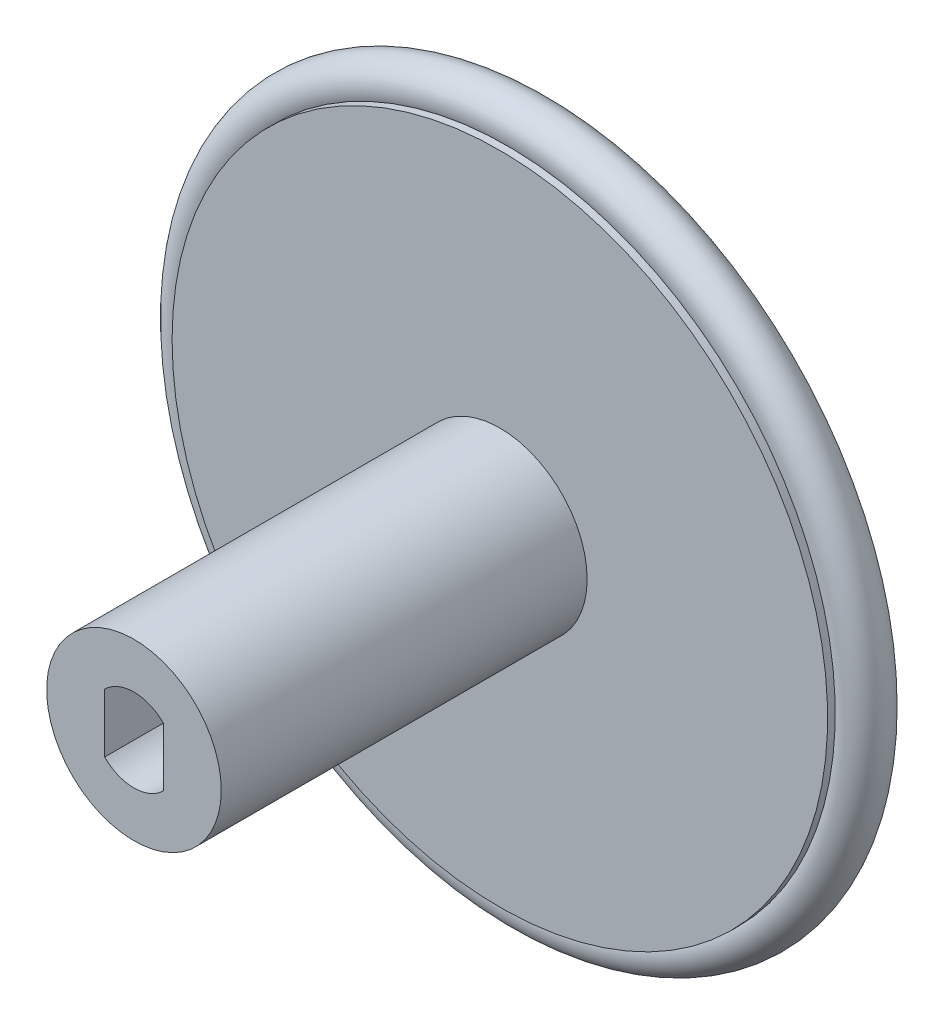
ISO-10303-21;
HEADER;
FILE_DESCRIPTION(('STEP AP214'),'2;1');
FILE_NAME('part.step','',(''),(''),'','','');
FILE_SCHEMA(('AUTOMOTIVE_DESIGN { 1 0 10303 214 1 1 1 1 }'));
ENDSEC;
DATA;
#1=APPLICATION_CONTEXT('core data for automotive mechanical design processes');
#2=APPLICATION_PROTOCOL_DEFINITION('international standard','automotive_design',2000,#1);
#3=PRODUCT_CONTEXT('',#1,'mechanical');
#4=PRODUCT('Part','Part','',(#3));
#5=PRODUCT_RELATED_PRODUCT_CATEGORY('part','',(#4));
#6=PRODUCT_DEFINITION_FORMATION('','',#4);
#7=PRODUCT_DEFINITION_CONTEXT('part definition',#1,'design');
#8=PRODUCT_DEFINITION('design','',#6,#7);
#9=PRODUCT_DEFINITION_SHAPE('','',#8);
#10=(LENGTH_UNIT() NAMED_UNIT(*) SI_UNIT(.MILLI.,.METRE.));
#11=(NAMED_UNIT(*) PLANE_ANGLE_UNIT() SI_UNIT($,.RADIAN.));
#12=(NAMED_UNIT(*) SI_UNIT($,.STERADIAN.) SOLID_ANGLE_UNIT());
#13=UNCERTAINTY_MEASURE_WITH_UNIT(LENGTH_MEASURE(1.E-05),#10,'distance_accuracy_value','');
#14=(GEOMETRIC_REPRESENTATION_CONTEXT(3) GLOBAL_UNCERTAINTY_ASSIGNED_CONTEXT((#13)) GLOBAL_UNIT_ASSIGNED_CONTEXT((#10,
#11,#12)) REPRESENTATION_CONTEXT('',''));
#15=CARTESIAN_POINT('',(0.,0.,0.));
#16=DIRECTION('',(0.,0.,1.));
#17=DIRECTION('',(1.,0.,0.));
#18=AXIS2_PLACEMENT_3D('',#15,#16,#17);
#19=CARTESIAN_POINT('',(0.,0.,0.));
#20=DIRECTION('',(0.,0.,1.));
#21=DIRECTION('',(1.,0.,0.));
#22=AXIS2_PLACEMENT_3D('',#19,#20,#21);
#23=TOROIDAL_SURFACE('',#22,22.039552593733,1.5);
#24=CARTESIAN_POINT('',(23.539552593733,0.,0.));
#25=VERTEX_POINT('',#24);
#26=VERTEX_LOOP('',#25);
#27=FACE_BOUND('',#26,.T.);
#28=ADVANCED_FACE('F44',(#27),#23,.T.);
#29=CLOSED_SHELL('',(#28));
#30=MANIFOLD_SOLID_BREP('B2_NOT_SHOWN',#29);
#31=CARTESIAN_POINT('',(0.,0.,-1.90000000000001));
#32=DIRECTION('',(0.,0.,-1.));
#33=DIRECTION('',(-1.,0.,0.));
#34=AXIS2_PLACEMENT_3D('',#31,#32,#33);
#35=PLANE('',#34);
#36=CARTESIAN_POINT('',(0.,0.,-1.90000000000001));
#37=DIRECTION('',(0.,0.,-1.));
#38=DIRECTION('',(-1.,0.,0.));
#39=AXIS2_PLACEMENT_3D('',#36,#37,#38);
#40=CIRCLE('',#39,21.5);
#41=CARTESIAN_POINT('',(-21.5,0.,-1.90000000000001));
#42=VERTEX_POINT('',#41);
#43=EDGE_CURVE('E59',#42,#42,#40,.T.);
#44=ORIENTED_EDGE('',*,*,#43,.T.);
#45=EDGE_LOOP('',(#44));
#46=FACE_BOUND('',#45,.T.);
#47=ADVANCED_FACE('F56',(#46),#35,.T.);
#48=CARTESIAN_POINT('',(0.,0.,-6.22705657946134));
#49=DIRECTION('',(0.,0.,-1.));
#50=DIRECTION('',(-1.,0.,0.));
#51=AXIS2_PLACEMENT_3D('',#48,#49,#50);
#52=CYLINDRICAL_SURFACE('',#51,21.5);
#53=CARTESIAN_POINT('',(0.,0.,-1.40000000000001));
#54=DIRECTION('',(0.,0.,-1.));
#55=DIRECTION('',(-1.,0.,0.));
#56=AXIS2_PLACEMENT_3D('',#53,#54,#55);
#57=CIRCLE('',#56,21.5);
#58=CARTESIAN_POINT('',(-21.5,0.,-1.40000000000001));
#59=VERTEX_POINT('',#58);
#60=EDGE_CURVE('E147',#59,#59,#57,.T.);
#61=ORIENTED_EDGE('',*,*,#60,.T.);
#62=EDGE_LOOP('',(#61));
#63=FACE_BOUND('',#62,.T.);
#64=ORIENTED_EDGE('',*,*,#43,.F.);
#65=EDGE_LOOP('',(#64));
#66=FACE_BOUND('',#65,.T.);
#67=ADVANCED_FACE('F155',(#63,#66),#52,.T.);
#68=CARTESIAN_POINT('',(0.,0.,-1.40000000000001));
#69=DIRECTION('',(0.,0.,-1.));
#70=DIRECTION('',(-1.,0.,0.));
#71=AXIS2_PLACEMENT_3D('',#68,#69,#70);
#72=CONICAL_SURFACE('',#71,21.5,1.22522113490003);
#73=CARTESIAN_POINT('',(0.,0.,-0.500000000000015));
#74=DIRECTION('',(0.,0.,-1.));
#75=DIRECTION('',(-1.,0.,0.));
#76=AXIS2_PLACEMENT_3D('',#73,#74,#75);
#77=CIRCLE('',#76,19.0001538314765);
#78=CARTESIAN_POINT('',(-19.0001538314765,0.,-0.500000000000015));
#79=VERTEX_POINT('',#78);
#80=EDGE_CURVE('E145',#79,#79,#77,.T.);
#81=ORIENTED_EDGE('',*,*,#80,.T.);
#82=EDGE_LOOP('',(#81));
#83=FACE_BOUND('',#82,.T.);
#84=ORIENTED_EDGE('',*,*,#60,.F.);
#85=EDGE_LOOP('',(#84));
#86=FACE_BOUND('',#85,.T.);
#87=ADVANCED_FACE('F157',(#83,#86),#72,.T.);
#88=CARTESIAN_POINT('',(0.,0.,-6.22705657946134));
#89=DIRECTION('',(0.,0.,-1.));
#90=DIRECTION('',(-1.,0.,0.));
#91=AXIS2_PLACEMENT_3D('',#88,#89,#90);
#92=CYLINDRICAL_SURFACE('',#91,19.0001538314765);
#93=CARTESIAN_POINT('',(0.,0.,0.500000000000007));
#94=DIRECTION('',(0.,0.,-1.));
#95=DIRECTION('',(-1.,0.,0.));
#96=AXIS2_PLACEMENT_3D('',#93,#94,#95);
#97=CIRCLE('',#96,19.0001538314765);
#98=CARTESIAN_POINT('',(-19.0001538314765,0.,0.500000000000007));
#99=VERTEX_POINT('',#98);
#100=EDGE_CURVE('E142',#99,#99,#97,.T.);
#101=ORIENTED_EDGE('',*,*,#100,.T.);
#102=EDGE_LOOP('',(#101));
#103=FACE_BOUND('',#102,.T.);
#104=ORIENTED_EDGE('',*,*,#80,.F.);
#105=EDGE_LOOP('',(#104));
#106=FACE_BOUND('',#105,.T.);
#107=ADVANCED_FACE('F162',(#103,#106),#92,.T.);
#108=CARTESIAN_POINT('',(0.,0.,0.500000000000007));
#109=DIRECTION('',(0.,0.,1.));
#110=DIRECTION('',(1.,0.,0.));
#111=AXIS2_PLACEMENT_3D('',#108,#109,#110);
#112=CONICAL_SURFACE('',#111,19.0001538314765,1.22522113490003);
#113=CARTESIAN_POINT('',(0.,0.,1.4));
#114=DIRECTION('',(0.,0.,-1.));
#115=DIRECTION('',(-1.,0.,0.));
#116=AXIS2_PLACEMENT_3D('',#113,#114,#115);
#117=CIRCLE('',#116,21.5);
#118=CARTESIAN_POINT('',(-21.5,0.,1.4));
#119=VERTEX_POINT('',#118);
#120=EDGE_CURVE('E139',#119,#119,#117,.T.);
#121=ORIENTED_EDGE('',*,*,#120,.T.);
#122=EDGE_LOOP('',(#121));
#123=FACE_BOUND('',#122,.T.);
#124=ORIENTED_EDGE('',*,*,#100,.F.);
#125=EDGE_LOOP('',(#124));
#126=FACE_BOUND('',#125,.T.);
#127=ADVANCED_FACE('F168',(#123,#126),#112,.T.);
#128=CARTESIAN_POINT('',(0.,0.,-6.22705657946134));
#129=DIRECTION('',(0.,0.,-1.));
#130=DIRECTION('',(-1.,0.,0.));
#131=AXIS2_PLACEMENT_3D('',#128,#129,#130);
#132=CYLINDRICAL_SURFACE('',#131,21.5);
#133=CARTESIAN_POINT('',(0.,0.,1.9));
#134=DIRECTION('',(0.,0.,-1.));
#135=DIRECTION('',(-1.,0.,0.));
#136=AXIS2_PLACEMENT_3D('',#133,#134,#135);
#137=CIRCLE('',#136,21.5);
#138=CARTESIAN_POINT('',(-21.5,0.,1.9));
#139=VERTEX_POINT('',#138);
#140=EDGE_CURVE('E135',#139,#139,#137,.T.);
#141=ORIENTED_EDGE('',*,*,#140,.T.);
#142=EDGE_LOOP('',(#141));
#143=FACE_BOUND('',#142,.T.);
#144=ORIENTED_EDGE('',*,*,#120,.F.);
#145=EDGE_LOOP('',(#144));
#146=FACE_BOUND('',#145,.T.);
#147=ADVANCED_FACE('F172',(#143,#146),#132,.T.);
#148=CARTESIAN_POINT('',(0.,0.,1.9));
#149=DIRECTION('',(0.,0.,1.));
#150=DIRECTION('',(1.,0.,0.));
#151=AXIS2_PLACEMENT_3D('',#148,#149,#150);
#152=PLANE('',#151);
#153=CARTESIAN_POINT('',(0.,0.,1.9));
#154=DIRECTION('',(0.,0.,1.));
#155=DIRECTION('',(1.,0.,0.));
#156=AXIS2_PLACEMENT_3D('',#153,#154,#155);
#157=CIRCLE('',#156,5.725);
#158=CARTESIAN_POINT('',(5.725,0.,1.9));
#159=VERTEX_POINT('',#158);
#160=EDGE_CURVE('E42',#159,#159,#157,.T.);
#161=ORIENTED_EDGE('',*,*,#160,.F.);
#162=EDGE_LOOP('',(#161));
#163=FACE_BOUND('',#162,.T.);
#164=ORIENTED_EDGE('',*,*,#140,.F.);
#165=EDGE_LOOP('',(#164));
#166=FACE_BOUND('',#165,.T.);
#167=ADVANCED_FACE('F176',(#163,#166),#152,.T.);
#168=CARTESIAN_POINT('',(0.,0.,25.9));
#169=DIRECTION('',(0.,0.,1.));
#170=DIRECTION('',(1.,0.,0.));
#171=AXIS2_PLACEMENT_3D('',#168,#169,#170);
#172=PLANE('',#171);
#173=CARTESIAN_POINT('',(0.,0.,25.9));
#174=DIRECTION('',(0.,0.,1.));
#175=DIRECTION('',(1.,0.,0.));
#176=AXIS2_PLACEMENT_3D('',#173,#174,#175);
#177=CIRCLE('',#176,5.725);
#178=CARTESIAN_POINT('',(5.725,0.,25.9));
#179=VERTEX_POINT('',#178);
#180=EDGE_CURVE('E133',#179,#179,#177,.T.);
#181=ORIENTED_EDGE('',*,*,#180,.T.);
#182=EDGE_LOOP('',(#181));
#183=FACE_BOUND('',#182,.T.);
#184=DIRECTION('',(0.,1.,0.));
#185=VECTOR('',#184,1.);
#186=CARTESIAN_POINT('',(1.925,1.92873015219859,25.9));
#187=LINE('',#186,#185);
#188=CARTESIAN_POINT('',(1.925,-1.92873015219859,25.9));
#189=VERTEX_POINT('',#188);
#190=CARTESIAN_POINT('',(1.925,1.92873015219859,25.9));
#191=VERTEX_POINT('',#190);
#192=EDGE_CURVE('E123',#189,#191,#187,.T.);
#193=ORIENTED_EDGE('',*,*,#192,.F.);
#194=CARTESIAN_POINT('',(0.,0.,25.9));
#195=DIRECTION('',(0.,0.,1.));
#196=DIRECTION('',(1.,0.,0.));
#197=AXIS2_PLACEMENT_3D('',#194,#195,#196);
#198=CIRCLE('',#197,2.72500000000001);
#199=CARTESIAN_POINT('',(-1.925,-1.92873015219859,25.9));
#200=VERTEX_POINT('',#199);
#201=EDGE_CURVE('E120',#200,#189,#198,.T.);
#202=ORIENTED_EDGE('',*,*,#201,.F.);
#203=DIRECTION('',(0.,-1.,0.));
#204=VECTOR('',#203,1.);
#205=CARTESIAN_POINT('',(-1.925,1.92873015219859,25.9));
#206=LINE('',#205,#204);
#207=CARTESIAN_POINT('',(-1.925,1.92873015219859,25.9));
#208=VERTEX_POINT('',#207);
#209=EDGE_CURVE('E105',#208,#200,#206,.T.);
#210=ORIENTED_EDGE('',*,*,#209,.F.);
#211=CARTESIAN_POINT('',(0.,0.,25.9));
#212=DIRECTION('',(0.,0.,1.));
#213=DIRECTION('',(-1.,0.,0.));
#214=AXIS2_PLACEMENT_3D('',#211,#212,#213);
#215=CIRCLE('',#214,2.725);
#216=EDGE_CURVE('E125',#191,#208,#215,.T.);
#217=ORIENTED_EDGE('',*,*,#216,.F.);
#218=EDGE_LOOP('',(#193,#202,#210,#217));
#219=FACE_BOUND('',#218,.T.);
#220=ADVANCED_FACE('F180',(#183,#219),#172,.T.);
#221=CARTESIAN_POINT('',(0.,0.,25.9));
#222=DIRECTION('',(0.,0.,-1.));
#223=DIRECTION('',(-1.,0.,0.));
#224=AXIS2_PLACEMENT_3D('',#221,#222,#223);
#225=CYLINDRICAL_SURFACE('',#224,5.725);
#226=ORIENTED_EDGE('',*,*,#180,.F.);
#227=EDGE_LOOP('',(#226));
#228=FACE_BOUND('',#227,.T.);
#229=ORIENTED_EDGE('',*,*,#160,.T.);
#230=EDGE_LOOP('',(#229));
#231=FACE_BOUND('',#230,.T.);
#232=ADVANCED_FACE('F182',(#228,#231),#225,.T.);
#233=CARTESIAN_POINT('',(0.,0.,25.9));
#234=DIRECTION('',(0.,0.,-1.));
#235=DIRECTION('',(-1.,0.,0.));
#236=AXIS2_PLACEMENT_3D('',#233,#234,#235);
#237=CYLINDRICAL_SURFACE('',#236,2.72500000000001);
#238=CARTESIAN_POINT('',(0.,0.,20.9));
#239=DIRECTION('',(0.,0.,1.));
#240=DIRECTION('',(1.,0.,0.));
#241=AXIS2_PLACEMENT_3D('',#238,#239,#240);
#242=CIRCLE('',#241,2.72500000000001);
#243=CARTESIAN_POINT('',(-1.925,-1.92873015219859,20.9));
#244=VERTEX_POINT('',#243);
#245=CARTESIAN_POINT('',(1.925,-1.92873015219859,20.9));
#246=VERTEX_POINT('',#245);
#247=EDGE_CURVE('E111',#244,#246,#242,.T.);
#248=ORIENTED_EDGE('',*,*,#247,.F.);
#249=DIRECTION('',(0.,0.,-1.));
#250=VECTOR('',#249,1.);
#251=CARTESIAN_POINT('',(-1.925,-1.92873015219859,25.9));
#252=LINE('',#251,#250);
#253=EDGE_CURVE('E99',#200,#244,#252,.T.);
#254=ORIENTED_EDGE('',*,*,#253,.F.);
#255=ORIENTED_EDGE('',*,*,#201,.T.);
#256=DIRECTION('',(0.,0.,-1.));
#257=VECTOR('',#256,1.);
#258=CARTESIAN_POINT('',(1.925,-1.92873015219859,25.9));
#259=LINE('',#258,#257);
#260=EDGE_CURVE('E113',#189,#246,#259,.T.);
#261=ORIENTED_EDGE('',*,*,#260,.T.);
#262=EDGE_LOOP('',(#248,#254,#255,#261));
#263=FACE_BOUND('',#262,.T.);
#264=ADVANCED_FACE('F112',(#263),#237,.F.);
#265=CARTESIAN_POINT('',(1.925,1.92873015219859,25.9));
#266=DIRECTION('',(-1.,0.,0.));
#267=DIRECTION('',(0.,0.,1.));
#268=AXIS2_PLACEMENT_3D('',#265,#266,#267);
#269=PLANE('',#268);
#270=DIRECTION('',(0.,1.,0.));
#271=VECTOR('',#270,1.);
#272=CARTESIAN_POINT('',(1.925,-1.92873015219859,20.9));
#273=LINE('',#272,#271);
#274=CARTESIAN_POINT('',(1.925,1.92873015219859,20.9));
#275=VERTEX_POINT('',#274);
#276=EDGE_CURVE('E71',#246,#275,#273,.T.);
#277=ORIENTED_EDGE('',*,*,#276,.F.);
#278=ORIENTED_EDGE('',*,*,#260,.F.);
#279=ORIENTED_EDGE('',*,*,#192,.T.);
#280=DIRECTION('',(0.,0.,-1.));
#281=VECTOR('',#280,1.);
#282=CARTESIAN_POINT('',(1.925,1.92873015219859,25.9));
#283=LINE('',#282,#281);
#284=EDGE_CURVE('E130',#191,#275,#283,.T.);
#285=ORIENTED_EDGE('',*,*,#284,.T.);
#286=EDGE_LOOP('',(#277,#278,#279,#285));
#287=FACE_BOUND('',#286,.T.);
#288=ADVANCED_FACE('F191',(#287),#269,.T.);
#289=CARTESIAN_POINT('',(0.,0.,25.9));
#290=DIRECTION('',(0.,0.,-1.));
#291=DIRECTION('',(-1.,0.,0.));
#292=AXIS2_PLACEMENT_3D('',#289,#290,#291);
#293=CYLINDRICAL_SURFACE('',#292,2.725);
#294=CARTESIAN_POINT('',(0.,0.,20.9));
#295=DIRECTION('',(0.,0.,1.));
#296=DIRECTION('',(1.,0.,0.));
#297=AXIS2_PLACEMENT_3D('',#294,#295,#296);
#298=CIRCLE('',#297,2.725);
#299=CARTESIAN_POINT('',(-1.925,1.92873015219859,20.9));
#300=VERTEX_POINT('',#299);
#301=EDGE_CURVE('E79',#275,#300,#298,.T.);
#302=ORIENTED_EDGE('',*,*,#301,.F.);
#303=ORIENTED_EDGE('',*,*,#284,.F.);
#304=ORIENTED_EDGE('',*,*,#216,.T.);
#305=DIRECTION('',(0.,0.,-1.));
#306=VECTOR('',#305,1.);
#307=CARTESIAN_POINT('',(-1.925,1.92873015219859,25.9));
#308=LINE('',#307,#306);
#309=EDGE_CURVE('E108',#208,#300,#308,.T.);
#310=ORIENTED_EDGE('',*,*,#309,.T.);
#311=EDGE_LOOP('',(#302,#303,#304,#310));
#312=FACE_BOUND('',#311,.T.);
#313=ADVANCED_FACE('F194',(#312),#293,.F.);
#314=CARTESIAN_POINT('',(-1.925,1.92873015219859,25.9));
#315=DIRECTION('',(1.,0.,0.));
#316=DIRECTION('',(0.,0.,-1.));
#317=AXIS2_PLACEMENT_3D('',#314,#315,#316);
#318=PLANE('',#317);
#319=DIRECTION('',(0.,-1.,0.));
#320=VECTOR('',#319,1.);
#321=CARTESIAN_POINT('',(-1.925,1.92873015219859,20.9));
#322=LINE('',#321,#320);
#323=EDGE_CURVE('E103',#300,#244,#322,.T.);
#324=ORIENTED_EDGE('',*,*,#323,.F.);
#325=ORIENTED_EDGE('',*,*,#309,.F.);
#326=ORIENTED_EDGE('',*,*,#209,.T.);
#327=ORIENTED_EDGE('',*,*,#253,.T.);
#328=EDGE_LOOP('',(#324,#325,#326,#327));
#329=FACE_BOUND('',#328,.T.);
#330=ADVANCED_FACE('F101',(#329),#318,.T.);
#331=CARTESIAN_POINT('',(0.,0.,20.9));
#332=DIRECTION('',(0.,0.,1.));
#333=DIRECTION('',(1.,0.,0.));
#334=AXIS2_PLACEMENT_3D('',#331,#332,#333);
#335=PLANE('',#334);
#336=ORIENTED_EDGE('',*,*,#301,.T.);
#337=ORIENTED_EDGE('',*,*,#323,.T.);
#338=ORIENTED_EDGE('',*,*,#247,.T.);
#339=ORIENTED_EDGE('',*,*,#276,.T.);
#340=EDGE_LOOP('',(#336,#337,#338,#339));
#341=FACE_BOUND('',#340,.T.);
#342=ADVANCED_FACE('F116',(#341),#335,.T.);
#343=CLOSED_SHELL('',(#47,#67,#87,#107,#127,#147,#167,#220,#232,#264,#288,#313,#330,#342));
#344=MANIFOLD_SOLID_BREP('B6',#343);
#345=ADVANCED_BREP_SHAPE_REPRESENTATION('',(#18,#30,#344),#14);
#346=SHAPE_DEFINITION_REPRESENTATION(#9,#345);
ENDSEC;
END-ISO-10303-21;
